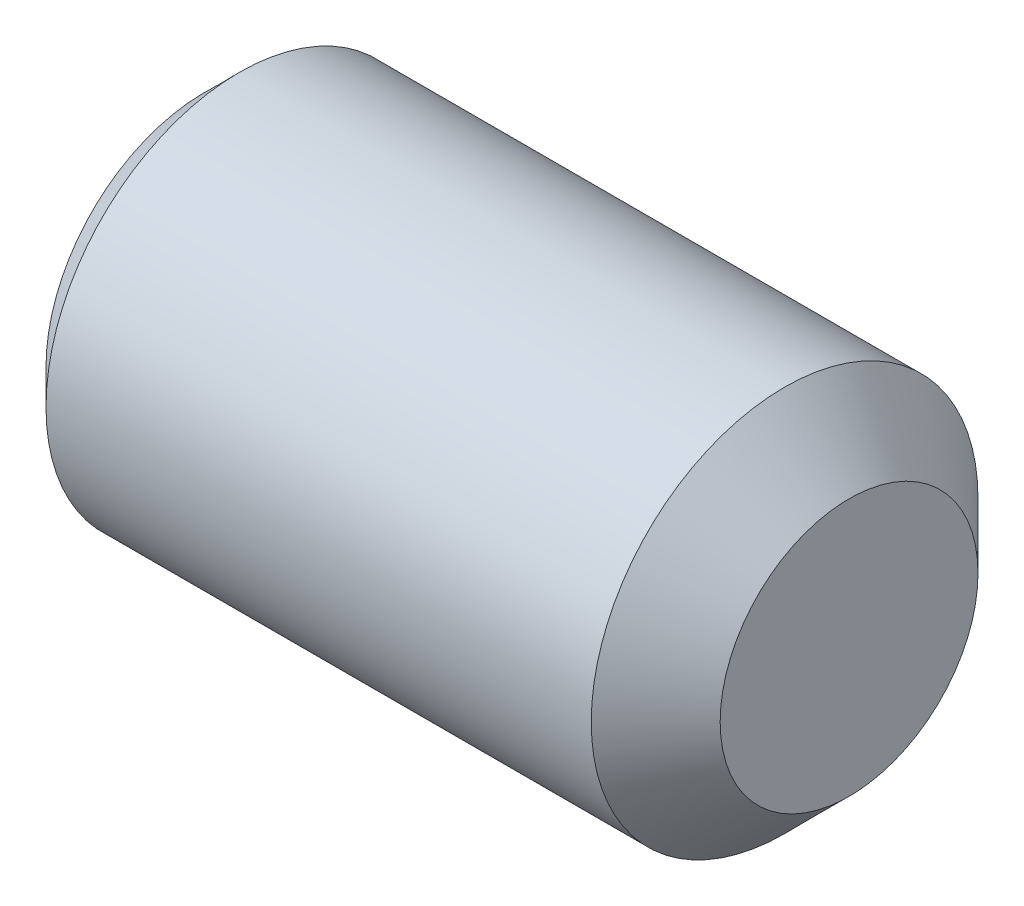
ISO-10303-21;
HEADER;
FILE_DESCRIPTION(('STEP AP214'),'2;1');
FILE_NAME('part.step','',(''),(''),'','','');
FILE_SCHEMA(('AUTOMOTIVE_DESIGN { 1 0 10303 214 1 1 1 1 }'));
ENDSEC;
DATA;
#1=APPLICATION_CONTEXT('core data for automotive mechanical design processes');
#2=APPLICATION_PROTOCOL_DEFINITION('international standard','automotive_design',2000,#1);
#3=PRODUCT_CONTEXT('',#1,'mechanical');
#4=PRODUCT('Part','Part','',(#3));
#5=PRODUCT_RELATED_PRODUCT_CATEGORY('part','',(#4));
#6=PRODUCT_DEFINITION_FORMATION('','',#4);
#7=PRODUCT_DEFINITION_CONTEXT('part definition',#1,'design');
#8=PRODUCT_DEFINITION('design','',#6,#7);
#9=PRODUCT_DEFINITION_SHAPE('','',#8);
#10=(LENGTH_UNIT() NAMED_UNIT(*) SI_UNIT(.MILLI.,.METRE.));
#11=(NAMED_UNIT(*) PLANE_ANGLE_UNIT() SI_UNIT($,.RADIAN.));
#12=(NAMED_UNIT(*) SI_UNIT($,.STERADIAN.) SOLID_ANGLE_UNIT());
#13=UNCERTAINTY_MEASURE_WITH_UNIT(LENGTH_MEASURE(1.E-05),#10,'distance_accuracy_value','');
#14=(GEOMETRIC_REPRESENTATION_CONTEXT(3) GLOBAL_UNCERTAINTY_ASSIGNED_CONTEXT((#13)) GLOBAL_UNIT_ASSIGNED_CONTEXT((#10,
#11,#12)) REPRESENTATION_CONTEXT('',''));
#15=CARTESIAN_POINT('',(0.,0.,0.));
#16=DIRECTION('',(0.,0.,1.));
#17=DIRECTION('',(1.,0.,0.));
#18=AXIS2_PLACEMENT_3D('',#15,#16,#17);
#19=CARTESIAN_POINT('',(5.,0.,0.));
#20=DIRECTION('',(-1.,0.,0.));
#21=DIRECTION('',(0.,0.,1.));
#22=AXIS2_PLACEMENT_3D('',#19,#20,#21);
#23=CYLINDRICAL_SURFACE('',#22,1.5);
#24=CARTESIAN_POINT('',(4.5,0.,0.));
#25=DIRECTION('',(1.,0.,0.));
#26=DIRECTION('',(0.,0.,-1.));
#27=AXIS2_PLACEMENT_3D('',#24,#25,#26);
#28=CIRCLE('',#27,1.5);
#29=CARTESIAN_POINT('',(4.5,0.,-1.5));
#30=VERTEX_POINT('',#29);
#31=EDGE_CURVE('E42',#30,#30,#28,.F.);
#32=ORIENTED_EDGE('',*,*,#31,.T.);
#33=EDGE_LOOP('',(#32));
#34=FACE_BOUND('',#33,.T.);
#35=CARTESIAN_POINT('',(0.270625000000002,0.,0.));
#36=DIRECTION('',(-1.,0.,0.));
#37=DIRECTION('',(0.,0.,1.));
#38=AXIS2_PLACEMENT_3D('',#35,#36,#37);
#39=CIRCLE('',#38,1.5);
#40=CARTESIAN_POINT('',(0.270625000000002,0.,1.5));
#41=VERTEX_POINT('',#40);
#42=EDGE_CURVE('E144',#41,#41,#39,.F.);
#43=ORIENTED_EDGE('',*,*,#42,.T.);
#44=EDGE_LOOP('',(#43));
#45=FACE_BOUND('',#44,.T.);
#46=ADVANCED_FACE('F34',(#34,#45),#23,.T.);
#47=CARTESIAN_POINT('',(5.,1.5,0.));
#48=DIRECTION('',(1.,0.,0.));
#49=DIRECTION('',(0.,0.,-1.));
#50=AXIS2_PLACEMENT_3D('',#47,#48,#49);
#51=PLANE('',#50);
#52=CARTESIAN_POINT('',(5.,0.,0.));
#53=DIRECTION('',(1.,0.,0.));
#54=DIRECTION('',(0.,0.,-1.));
#55=AXIS2_PLACEMENT_3D('',#52,#53,#54);
#56=CIRCLE('',#55,0.999999999999998);
#57=CARTESIAN_POINT('',(5.,0.,-0.999999999999998));
#58=VERTEX_POINT('',#57);
#59=EDGE_CURVE('E11',#58,#58,#56,.T.);
#60=ORIENTED_EDGE('',*,*,#59,.T.);
#61=EDGE_LOOP('',(#60));
#62=FACE_BOUND('',#61,.T.);
#63=ADVANCED_FACE('F160',(#62),#51,.T.);
#64=CARTESIAN_POINT('',(0.,0.,0.));
#65=DIRECTION('',(-1.,0.,0.));
#66=DIRECTION('',(0.,0.,1.));
#67=AXIS2_PLACEMENT_3D('',#64,#65,#66);
#68=PLANE('',#67);
#69=CARTESIAN_POINT('',(0.,0.,0.));
#70=DIRECTION('',(-1.,0.,0.));
#71=DIRECTION('',(0.,0.,1.));
#72=AXIS2_PLACEMENT_3D('',#69,#70,#71);
#73=CIRCLE('',#72,1.229375);
#74=CARTESIAN_POINT('',(0.,0.,1.229375));
#75=VERTEX_POINT('',#74);
#76=EDGE_CURVE('E136',#75,#75,#73,.T.);
#77=ORIENTED_EDGE('',*,*,#76,.T.);
#78=EDGE_LOOP('',(#77));
#79=FACE_BOUND('',#78,.T.);
#80=DIRECTION('',(0.,-1.,0.));
#81=VECTOR('',#80,1.);
#82=CARTESIAN_POINT('',(0.,0.433012701892219,-0.75));
#83=LINE('',#82,#81);
#84=CARTESIAN_POINT('',(0.,0.433012701892219,-0.75));
#85=VERTEX_POINT('',#84);
#86=CARTESIAN_POINT('',(0.,-0.43301270189222,-0.75));
#87=VERTEX_POINT('',#86);
#88=EDGE_CURVE('E49',#85,#87,#83,.T.);
#89=ORIENTED_EDGE('',*,*,#88,.F.);
#90=DIRECTION('',(0.,-0.500000000000001,-0.866025403784438));
#91=VECTOR('',#90,1.);
#92=CARTESIAN_POINT('',(0.,0.866025403784439,0.));
#93=LINE('',#92,#91);
#94=CARTESIAN_POINT('',(0.,0.866025403784439,0.));
#95=VERTEX_POINT('',#94);
#96=EDGE_CURVE('E132',#95,#85,#93,.T.);
#97=ORIENTED_EDGE('',*,*,#96,.F.);
#98=DIRECTION('',(0.,0.5,-0.866025403784439));
#99=VECTOR('',#98,1.);
#100=CARTESIAN_POINT('',(0.,0.43301270189222,0.75));
#101=LINE('',#100,#99);
#102=CARTESIAN_POINT('',(0.,0.43301270189222,0.75));
#103=VERTEX_POINT('',#102);
#104=EDGE_CURVE('E130',#103,#95,#101,.T.);
#105=ORIENTED_EDGE('',*,*,#104,.F.);
#106=DIRECTION('',(0.,1.,0.));
#107=VECTOR('',#106,1.);
#108=CARTESIAN_POINT('',(0.,-0.433012701892218,0.75));
#109=LINE('',#108,#107);
#110=CARTESIAN_POINT('',(0.,-0.433012701892218,0.75));
#111=VERTEX_POINT('',#110);
#112=EDGE_CURVE('E97',#111,#103,#109,.T.);
#113=ORIENTED_EDGE('',*,*,#112,.F.);
#114=DIRECTION('',(0.,0.500000000000001,0.866025403784438));
#115=VECTOR('',#114,1.);
#116=CARTESIAN_POINT('',(0.,-0.866025403784439,0.));
#117=LINE('',#116,#115);
#118=CARTESIAN_POINT('',(0.,-0.866025403784439,0.));
#119=VERTEX_POINT('',#118);
#120=EDGE_CURVE('E126',#119,#111,#117,.T.);
#121=ORIENTED_EDGE('',*,*,#120,.F.);
#122=DIRECTION('',(0.,-0.5,0.866025403784439));
#123=VECTOR('',#122,1.);
#124=CARTESIAN_POINT('',(0.,-0.43301270189222,-0.75));
#125=LINE('',#124,#123);
#126=EDGE_CURVE('E123',#87,#119,#125,.T.);
#127=ORIENTED_EDGE('',*,*,#126,.F.);
#128=EDGE_LOOP('',(#89,#97,#105,#113,#121,#127));
#129=FACE_BOUND('',#128,.T.);
#130=ADVANCED_FACE('F165',(#79,#129),#68,.T.);
#131=CARTESIAN_POINT('',(1.2,0.433012701892219,-0.75));
#132=DIRECTION('',(0.,0.,-1.));
#133=DIRECTION('',(-1.,0.,0.));
#134=AXIS2_PLACEMENT_3D('',#131,#132,#133);
#135=PLANE('',#134);
#136=ORIENTED_EDGE('',*,*,#88,.T.);
#137=DIRECTION('',(-1.,0.,0.));
#138=VECTOR('',#137,1.);
#139=CARTESIAN_POINT('',(1.2,-0.43301270189222,-0.75));
#140=LINE('',#139,#138);
#141=CARTESIAN_POINT('',(1.2,-0.43301270189222,-0.75));
#142=VERTEX_POINT('',#141);
#143=EDGE_CURVE('E79',#142,#87,#140,.T.);
#144=ORIENTED_EDGE('',*,*,#143,.F.);
#145=DIRECTION('',(0.,-1.,0.));
#146=VECTOR('',#145,1.);
#147=CARTESIAN_POINT('',(1.2,0.433012701892219,-0.75));
#148=LINE('',#147,#146);
#149=CARTESIAN_POINT('',(1.2,0.433012701892219,-0.75));
#150=VERTEX_POINT('',#149);
#151=EDGE_CURVE('E134',#150,#142,#148,.T.);
#152=ORIENTED_EDGE('',*,*,#151,.F.);
#153=DIRECTION('',(-1.,0.,0.));
#154=VECTOR('',#153,1.);
#155=CARTESIAN_POINT('',(1.2,0.433012701892219,-0.75));
#156=LINE('',#155,#154);
#157=EDGE_CURVE('E57',#150,#85,#156,.T.);
#158=ORIENTED_EDGE('',*,*,#157,.T.);
#159=EDGE_LOOP('',(#136,#144,#152,#158));
#160=FACE_BOUND('',#159,.T.);
#161=ADVANCED_FACE('F171',(#160),#135,.F.);
#162=CARTESIAN_POINT('',(1.2,0.866025403784439,0.));
#163=DIRECTION('',(0.,0.866025403784438,-0.500000000000001));
#164=DIRECTION('',(0.,0.500000000000001,0.866025403784438));
#165=AXIS2_PLACEMENT_3D('',#162,#163,#164);
#166=PLANE('',#165);
#167=ORIENTED_EDGE('',*,*,#96,.T.);
#168=ORIENTED_EDGE('',*,*,#157,.F.);
#169=DIRECTION('',(0.,-0.500000000000001,-0.866025403784438));
#170=VECTOR('',#169,1.);
#171=CARTESIAN_POINT('',(1.2,0.866025403784439,0.));
#172=LINE('',#171,#170);
#173=CARTESIAN_POINT('',(1.2,0.866025403784439,0.));
#174=VERTEX_POINT('',#173);
#175=EDGE_CURVE('E109',#174,#150,#172,.T.);
#176=ORIENTED_EDGE('',*,*,#175,.F.);
#177=DIRECTION('',(-1.,0.,0.));
#178=VECTOR('',#177,1.);
#179=CARTESIAN_POINT('',(1.2,0.866025403784439,0.));
#180=LINE('',#179,#178);
#181=EDGE_CURVE('E101',#174,#95,#180,.T.);
#182=ORIENTED_EDGE('',*,*,#181,.T.);
#183=EDGE_LOOP('',(#167,#168,#176,#182));
#184=FACE_BOUND('',#183,.T.);
#185=ADVANCED_FACE('F175',(#184),#166,.F.);
#186=CARTESIAN_POINT('',(1.2,0.43301270189222,0.75));
#187=DIRECTION('',(0.,0.866025403784439,0.5));
#188=DIRECTION('',(0.,-0.5,0.866025403784439));
#189=AXIS2_PLACEMENT_3D('',#186,#187,#188);
#190=PLANE('',#189);
#191=ORIENTED_EDGE('',*,*,#104,.T.);
#192=ORIENTED_EDGE('',*,*,#181,.F.);
#193=DIRECTION('',(0.,0.5,-0.866025403784439));
#194=VECTOR('',#193,1.);
#195=CARTESIAN_POINT('',(1.2,0.43301270189222,0.75));
#196=LINE('',#195,#194);
#197=CARTESIAN_POINT('',(1.2,0.43301270189222,0.75));
#198=VERTEX_POINT('',#197);
#199=EDGE_CURVE('E105',#198,#174,#196,.T.);
#200=ORIENTED_EDGE('',*,*,#199,.F.);
#201=DIRECTION('',(-1.,0.,0.));
#202=VECTOR('',#201,1.);
#203=CARTESIAN_POINT('',(1.2,0.43301270189222,0.75));
#204=LINE('',#203,#202);
#205=EDGE_CURVE('E90',#198,#103,#204,.T.);
#206=ORIENTED_EDGE('',*,*,#205,.T.);
#207=EDGE_LOOP('',(#191,#192,#200,#206));
#208=FACE_BOUND('',#207,.T.);
#209=ADVANCED_FACE('F106',(#208),#190,.F.);
#210=CARTESIAN_POINT('',(1.2,-0.433012701892218,0.75));
#211=DIRECTION('',(0.,0.,1.));
#212=DIRECTION('',(1.,0.,0.));
#213=AXIS2_PLACEMENT_3D('',#210,#211,#212);
#214=PLANE('',#213);
#215=ORIENTED_EDGE('',*,*,#112,.T.);
#216=ORIENTED_EDGE('',*,*,#205,.F.);
#217=DIRECTION('',(0.,1.,0.));
#218=VECTOR('',#217,1.);
#219=CARTESIAN_POINT('',(1.2,-0.433012701892218,0.75));
#220=LINE('',#219,#218);
#221=CARTESIAN_POINT('',(1.2,-0.433012701892218,0.75));
#222=VERTEX_POINT('',#221);
#223=EDGE_CURVE('E94',#222,#198,#220,.T.);
#224=ORIENTED_EDGE('',*,*,#223,.F.);
#225=DIRECTION('',(-1.,0.,0.));
#226=VECTOR('',#225,1.);
#227=CARTESIAN_POINT('',(1.2,-0.433012701892218,0.75));
#228=LINE('',#227,#226);
#229=EDGE_CURVE('E102',#222,#111,#228,.T.);
#230=ORIENTED_EDGE('',*,*,#229,.T.);
#231=EDGE_LOOP('',(#215,#216,#224,#230));
#232=FACE_BOUND('',#231,.T.);
#233=ADVANCED_FACE('F92',(#232),#214,.F.);
#234=CARTESIAN_POINT('',(1.2,-0.866025403784439,0.));
#235=DIRECTION('',(0.,-0.866025403784438,0.500000000000001));
#236=DIRECTION('',(0.,-0.500000000000001,-0.866025403784438));
#237=AXIS2_PLACEMENT_3D('',#234,#235,#236);
#238=PLANE('',#237);
#239=ORIENTED_EDGE('',*,*,#120,.T.);
#240=ORIENTED_EDGE('',*,*,#229,.F.);
#241=DIRECTION('',(0.,0.500000000000001,0.866025403784438));
#242=VECTOR('',#241,1.);
#243=CARTESIAN_POINT('',(1.2,-0.866025403784439,0.));
#244=LINE('',#243,#242);
#245=CARTESIAN_POINT('',(1.2,-0.866025403784439,0.));
#246=VERTEX_POINT('',#245);
#247=EDGE_CURVE('E115',#246,#222,#244,.T.);
#248=ORIENTED_EDGE('',*,*,#247,.F.);
#249=DIRECTION('',(-1.,0.,0.));
#250=VECTOR('',#249,1.);
#251=CARTESIAN_POINT('',(1.2,-0.866025403784439,0.));
#252=LINE('',#251,#250);
#253=EDGE_CURVE('E139',#246,#119,#252,.T.);
#254=ORIENTED_EDGE('',*,*,#253,.T.);
#255=EDGE_LOOP('',(#239,#240,#248,#254));
#256=FACE_BOUND('',#255,.T.);
#257=ADVANCED_FACE('F179',(#256),#238,.F.);
#258=CARTESIAN_POINT('',(1.2,-0.43301270189222,-0.75));
#259=DIRECTION('',(0.,-0.866025403784439,-0.5));
#260=DIRECTION('',(0.,0.5,-0.866025403784439));
#261=AXIS2_PLACEMENT_3D('',#258,#259,#260);
#262=PLANE('',#261);
#263=ORIENTED_EDGE('',*,*,#126,.T.);
#264=ORIENTED_EDGE('',*,*,#253,.F.);
#265=DIRECTION('',(0.,-0.5,0.866025403784439));
#266=VECTOR('',#265,1.);
#267=CARTESIAN_POINT('',(1.2,-0.43301270189222,-0.75));
#268=LINE('',#267,#266);
#269=EDGE_CURVE('E117',#142,#246,#268,.T.);
#270=ORIENTED_EDGE('',*,*,#269,.F.);
#271=ORIENTED_EDGE('',*,*,#143,.T.);
#272=EDGE_LOOP('',(#263,#264,#270,#271));
#273=FACE_BOUND('',#272,.T.);
#274=ADVANCED_FACE('F176',(#273),#262,.F.);
#275=CARTESIAN_POINT('',(1.2,0.,0.));
#276=DIRECTION('',(-1.,0.,0.));
#277=DIRECTION('',(0.,0.,1.));
#278=AXIS2_PLACEMENT_3D('',#275,#276,#277);
#279=PLANE('',#278);
#280=ORIENTED_EDGE('',*,*,#151,.T.);
#281=ORIENTED_EDGE('',*,*,#269,.T.);
#282=ORIENTED_EDGE('',*,*,#247,.T.);
#283=ORIENTED_EDGE('',*,*,#223,.T.);
#284=ORIENTED_EDGE('',*,*,#199,.T.);
#285=ORIENTED_EDGE('',*,*,#175,.T.);
#286=EDGE_LOOP('',(#280,#281,#282,#283,#284,#285));
#287=FACE_BOUND('',#286,.T.);
#288=ADVANCED_FACE('F112',(#287),#279,.T.);
#289=CARTESIAN_POINT('',(0.,0.,0.));
#290=DIRECTION('',(1.,0.,0.));
#291=DIRECTION('',(0.,0.,-1.));
#292=AXIS2_PLACEMENT_3D('',#289,#290,#291);
#293=CONICAL_SURFACE('',#292,1.229375,0.785398163397446);
#294=ORIENTED_EDGE('',*,*,#42,.F.);
#295=EDGE_LOOP('',(#294));
#296=FACE_BOUND('',#295,.T.);
#297=ORIENTED_EDGE('',*,*,#76,.F.);
#298=EDGE_LOOP('',(#297));
#299=FACE_BOUND('',#298,.T.);
#300=ADVANCED_FACE('F152',(#296,#299),#293,.T.);
#301=CARTESIAN_POINT('',(4.5,0.,0.));
#302=DIRECTION('',(-1.,0.,0.));
#303=DIRECTION('',(0.,0.,1.));
#304=AXIS2_PLACEMENT_3D('',#301,#302,#303);
#305=CONICAL_SURFACE('',#304,1.5,0.785398163397453);
#306=ORIENTED_EDGE('',*,*,#59,.F.);
#307=EDGE_LOOP('',(#306));
#308=FACE_BOUND('',#307,.T.);
#309=ORIENTED_EDGE('',*,*,#31,.F.);
#310=EDGE_LOOP('',(#309));
#311=FACE_BOUND('',#310,.T.);
#312=ADVANCED_FACE('F36',(#308,#311),#305,.T.);
#313=CLOSED_SHELL('',(#46,#63,#130,#161,#185,#209,#233,#257,#274,#288,#300,#312));
#314=MANIFOLD_SOLID_BREP('B2',#313);
#315=ADVANCED_BREP_SHAPE_REPRESENTATION('',(#18,#314),#14);
#316=SHAPE_DEFINITION_REPRESENTATION(#9,#315);
ENDSEC;
END-ISO-10303-21;
